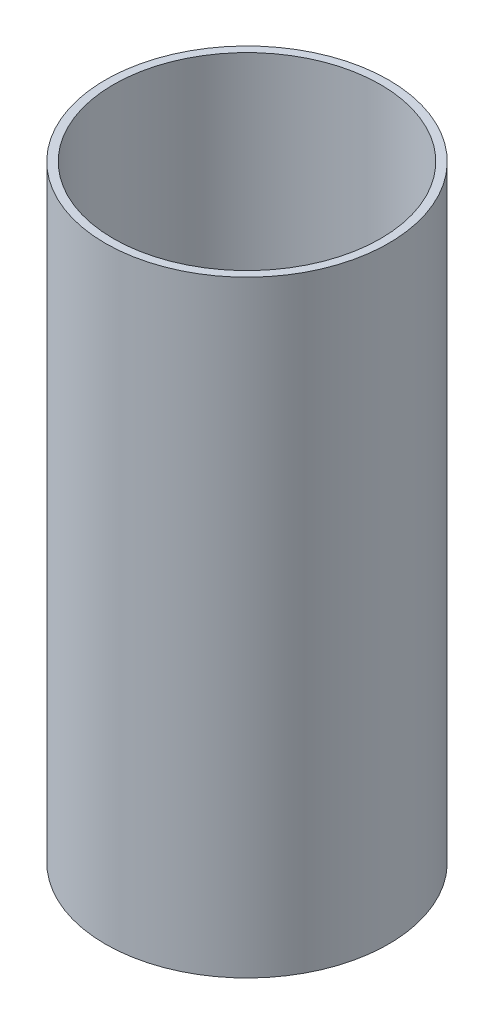
ISO-10303-21;
HEADER;
FILE_DESCRIPTION(('STEP AP214'),'2;1');
FILE_NAME('part.step','',(''),(''),'','','');
FILE_SCHEMA(('AUTOMOTIVE_DESIGN { 1 0 10303 214 1 1 1 1 }'));
ENDSEC;
DATA;
#1=APPLICATION_CONTEXT('core data for automotive mechanical design processes');
#2=APPLICATION_PROTOCOL_DEFINITION('international standard','automotive_design',2000,#1);
#3=PRODUCT_CONTEXT('',#1,'mechanical');
#4=PRODUCT('Part','Part','',(#3));
#5=PRODUCT_RELATED_PRODUCT_CATEGORY('part','',(#4));
#6=PRODUCT_DEFINITION_FORMATION('','',#4);
#7=PRODUCT_DEFINITION_CONTEXT('part definition',#1,'design');
#8=PRODUCT_DEFINITION('design','',#6,#7);
#9=PRODUCT_DEFINITION_SHAPE('','',#8);
#10=(LENGTH_UNIT() NAMED_UNIT(*) SI_UNIT(.MILLI.,.METRE.));
#11=(NAMED_UNIT(*) PLANE_ANGLE_UNIT() SI_UNIT($,.RADIAN.));
#12=(NAMED_UNIT(*) SI_UNIT($,.STERADIAN.) SOLID_ANGLE_UNIT());
#13=UNCERTAINTY_MEASURE_WITH_UNIT(LENGTH_MEASURE(1.E-05),#10,'distance_accuracy_value','');
#14=(GEOMETRIC_REPRESENTATION_CONTEXT(3) GLOBAL_UNCERTAINTY_ASSIGNED_CONTEXT((#13)) GLOBAL_UNIT_ASSIGNED_CONTEXT((#10,
#11,#12)) REPRESENTATION_CONTEXT('',''));
#15=CARTESIAN_POINT('',(0.,0.,0.));
#16=DIRECTION('',(0.,0.,1.));
#17=DIRECTION('',(1.,0.,0.));
#18=AXIS2_PLACEMENT_3D('',#15,#16,#17);
#19=CARTESIAN_POINT('',(0.,26.1689859870494,0.));
#20=DIRECTION('',(0.,1.,0.));
#21=DIRECTION('',(0.,0.,1.));
#22=AXIS2_PLACEMENT_3D('',#19,#20,#21);
#23=CYLINDRICAL_SURFACE('',#22,70.);
#24=CARTESIAN_POINT('',(0.,0.,0.));
#25=DIRECTION('',(0.,1.,0.));
#26=DIRECTION('',(0.,0.,1.));
#27=AXIS2_PLACEMENT_3D('',#24,#25,#26);
#28=CIRCLE('',#27,70.);
#29=CARTESIAN_POINT('',(0.,0.,70.));
#30=VERTEX_POINT('',#29);
#31=EDGE_CURVE('E47',#30,#30,#28,.T.);
#32=ORIENTED_EDGE('',*,*,#31,.T.);
#33=EDGE_LOOP('',(#32));
#34=FACE_BOUND('',#33,.T.);
#35=CARTESIAN_POINT('',(0.,300.,0.));
#36=DIRECTION('',(0.,1.,0.));
#37=DIRECTION('',(0.,0.,1.));
#38=AXIS2_PLACEMENT_3D('',#35,#36,#37);
#39=CIRCLE('',#38,70.);
#40=CARTESIAN_POINT('',(0.,300.,70.));
#41=VERTEX_POINT('',#40);
#42=EDGE_CURVE('E10',#41,#41,#39,.T.);
#43=ORIENTED_EDGE('',*,*,#42,.F.);
#44=EDGE_LOOP('',(#43));
#45=FACE_BOUND('',#44,.T.);
#46=ADVANCED_FACE('F33',(#34,#45),#23,.T.);
#47=CARTESIAN_POINT('',(-70.,300.,0.));
#48=DIRECTION('',(0.,-1.,0.));
#49=DIRECTION('',(0.,0.,-1.));
#50=AXIS2_PLACEMENT_3D('',#47,#48,#49);
#51=PLANE('',#50);
#52=CARTESIAN_POINT('',(0.,300.,0.));
#53=DIRECTION('',(0.,1.,0.));
#54=DIRECTION('',(0.,0.,1.));
#55=AXIS2_PLACEMENT_3D('',#52,#53,#54);
#56=CIRCLE('',#55,66.);
#57=CARTESIAN_POINT('',(0.,300.,66.));
#58=VERTEX_POINT('',#57);
#59=EDGE_CURVE('E39',#58,#58,#56,.T.);
#60=ORIENTED_EDGE('',*,*,#59,.F.);
#61=EDGE_LOOP('',(#60));
#62=FACE_BOUND('',#61,.T.);
#63=ORIENTED_EDGE('',*,*,#42,.T.);
#64=EDGE_LOOP('',(#63));
#65=FACE_BOUND('',#64,.T.);
#66=ADVANCED_FACE('F63',(#62,#65),#51,.F.);
#67=CARTESIAN_POINT('',(0.,26.1689859870494,0.));
#68=DIRECTION('',(0.,1.,0.));
#69=DIRECTION('',(0.,0.,1.));
#70=AXIS2_PLACEMENT_3D('',#67,#68,#69);
#71=CYLINDRICAL_SURFACE('',#70,66.);
#72=CARTESIAN_POINT('',(0.,0.,0.));
#73=DIRECTION('',(0.,1.,0.));
#74=DIRECTION('',(0.,0.,1.));
#75=AXIS2_PLACEMENT_3D('',#72,#73,#74);
#76=CIRCLE('',#75,66.);
#77=CARTESIAN_POINT('',(0.,0.,66.));
#78=VERTEX_POINT('',#77);
#79=EDGE_CURVE('E43',#78,#78,#76,.T.);
#80=ORIENTED_EDGE('',*,*,#79,.F.);
#81=EDGE_LOOP('',(#80));
#82=FACE_BOUND('',#81,.T.);
#83=ORIENTED_EDGE('',*,*,#59,.T.);
#84=EDGE_LOOP('',(#83));
#85=FACE_BOUND('',#84,.T.);
#86=ADVANCED_FACE('F58',(#82,#85),#71,.F.);
#87=CARTESIAN_POINT('',(-66.,0.,0.));
#88=DIRECTION('',(0.,1.,0.));
#89=DIRECTION('',(0.,0.,1.));
#90=AXIS2_PLACEMENT_3D('',#87,#88,#89);
#91=PLANE('',#90);
#92=ORIENTED_EDGE('',*,*,#31,.F.);
#93=EDGE_LOOP('',(#92));
#94=FACE_BOUND('',#93,.T.);
#95=ORIENTED_EDGE('',*,*,#79,.T.);
#96=EDGE_LOOP('',(#95));
#97=FACE_BOUND('',#96,.T.);
#98=ADVANCED_FACE('F55',(#94,#97),#91,.F.);
#99=CLOSED_SHELL('',(#46,#66,#86,#98));
#100=MANIFOLD_SOLID_BREP('B2',#99);
#101=ADVANCED_BREP_SHAPE_REPRESENTATION('',(#18,#100),#14);
#102=SHAPE_DEFINITION_REPRESENTATION(#9,#101);
ENDSEC;
END-ISO-10303-21;
